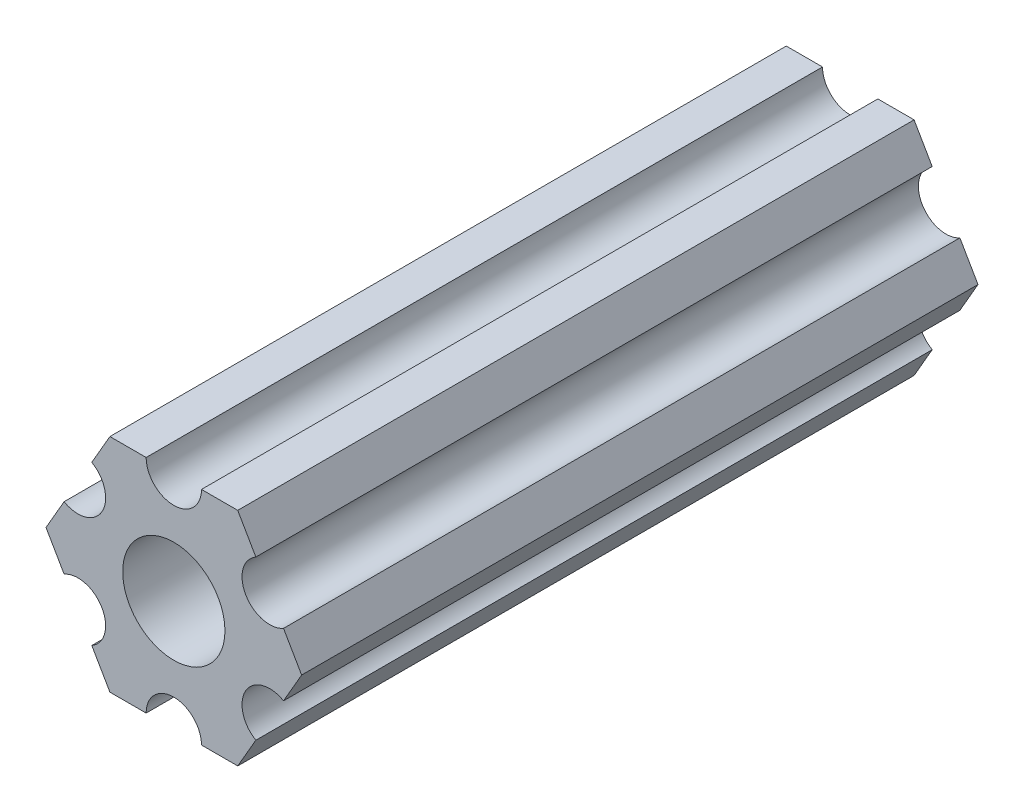
ISO-10303-21;
HEADER;
FILE_DESCRIPTION(('STEP AP214'),'2;1');
FILE_NAME('part.step','',(''),(''),'','','');
FILE_SCHEMA(('AUTOMOTIVE_DESIGN { 1 0 10303 214 1 1 1 1 }'));
ENDSEC;
DATA;
#1=APPLICATION_CONTEXT('core data for automotive mechanical design processes');
#2=APPLICATION_PROTOCOL_DEFINITION('international standard','automotive_design',2000,#1);
#3=PRODUCT_CONTEXT('',#1,'mechanical');
#4=PRODUCT('Part','Part','',(#3));
#5=PRODUCT_RELATED_PRODUCT_CATEGORY('part','',(#4));
#6=PRODUCT_DEFINITION_FORMATION('','',#4);
#7=PRODUCT_DEFINITION_CONTEXT('part definition',#1,'design');
#8=PRODUCT_DEFINITION('design','',#6,#7);
#9=PRODUCT_DEFINITION_SHAPE('','',#8);
#10=(LENGTH_UNIT() NAMED_UNIT(*) SI_UNIT(.MILLI.,.METRE.));
#11=(NAMED_UNIT(*) PLANE_ANGLE_UNIT() SI_UNIT($,.RADIAN.));
#12=(NAMED_UNIT(*) SI_UNIT($,.STERADIAN.) SOLID_ANGLE_UNIT());
#13=UNCERTAINTY_MEASURE_WITH_UNIT(LENGTH_MEASURE(1.E-05),#10,'distance_accuracy_value','');
#14=(GEOMETRIC_REPRESENTATION_CONTEXT(3) GLOBAL_UNCERTAINTY_ASSIGNED_CONTEXT((#13)) GLOBAL_UNIT_ASSIGNED_CONTEXT((#10,
#11,#12)) REPRESENTATION_CONTEXT('',''));
#15=CARTESIAN_POINT('',(0.,0.,0.));
#16=DIRECTION('',(0.,0.,1.));
#17=DIRECTION('',(1.,0.,0.));
#18=AXIS2_PLACEMENT_3D('',#15,#16,#17);
#19=CARTESIAN_POINT('',(621.242126310948,353.435610690712,-38.8));
#20=DIRECTION('',(0.,0.,1.));
#21=DIRECTION('',(1.,0.,0.));
#22=AXIS2_PLACEMENT_3D('',#19,#20,#21);
#23=CYLINDRICAL_SURFACE('',#22,1.58750000000002);
#24=CARTESIAN_POINT('',(621.242126310948,353.435610690712,0.));
#25=DIRECTION('',(0.,0.,-1.));
#26=DIRECTION('',(1.,0.,0.));
#27=AXIS2_PLACEMENT_3D('',#24,#25,#26);
#28=CIRCLE('',#27,1.58750000000002);
#29=CARTESIAN_POINT('',(622.035876310948,352.060795362204,0.));
#30=VERTEX_POINT('',#29);
#31=CARTESIAN_POINT('',(620.448376310948,354.81042601922,0.));
#32=VERTEX_POINT('',#31);
#33=EDGE_CURVE('E273',#30,#32,#28,.T.);
#34=ORIENTED_EDGE('',*,*,#33,.F.);
#35=DIRECTION('',(0.,0.,1.));
#36=VECTOR('',#35,1.);
#37=CARTESIAN_POINT('',(622.035876310948,352.060795362204,-38.8));
#38=LINE('',#37,#36);
#39=CARTESIAN_POINT('',(622.035876310948,352.060795362204,-38.8));
#40=VERTEX_POINT('',#39);
#41=EDGE_CURVE('E11',#40,#30,#38,.T.);
#42=ORIENTED_EDGE('',*,*,#41,.F.);
#43=CARTESIAN_POINT('',(621.242126310948,353.435610690712,-38.8));
#44=DIRECTION('',(0.,0.,-1.));
#45=DIRECTION('',(1.,0.,0.));
#46=AXIS2_PLACEMENT_3D('',#43,#44,#45);
#47=CIRCLE('',#46,1.58749999999999);
#48=CARTESIAN_POINT('',(620.448376310948,354.81042601922,-38.8));
#49=VERTEX_POINT('',#48);
#50=EDGE_CURVE('E63',#40,#49,#47,.T.);
#51=ORIENTED_EDGE('',*,*,#50,.T.);
#52=DIRECTION('',(0.,0.,1.));
#53=VECTOR('',#52,1.);
#54=CARTESIAN_POINT('',(620.448376310948,354.81042601922,-38.8));
#55=LINE('',#54,#53);
#56=EDGE_CURVE('E47',#49,#32,#55,.T.);
#57=ORIENTED_EDGE('',*,*,#56,.T.);
#58=EDGE_LOOP('',(#34,#42,#51,#57));
#59=FACE_BOUND('',#58,.T.);
#60=ADVANCED_FACE('F43',(#59),#23,.F.);
#61=CARTESIAN_POINT('',(623.075213415625,350.260610690712,-38.8));
#62=DIRECTION('',(0.866025403784456,0.49999999999997,0.));
#63=DIRECTION('',(-0.49999999999997,0.866025403784456,0.));
#64=AXIS2_PLACEMENT_3D('',#61,#62,#63);
#65=PLANE('',#64);
#66=DIRECTION('',(-0.49999999999997,0.866025403784456,0.));
#67=VECTOR('',#66,1.);
#68=CARTESIAN_POINT('',(623.075213415625,350.260610690712,0.));
#69=LINE('',#68,#67);
#70=CARTESIAN_POINT('',(623.075213415625,350.260610690712,0.));
#71=VERTEX_POINT('',#70);
#72=EDGE_CURVE('E270',#71,#30,#69,.T.);
#73=ORIENTED_EDGE('',*,*,#72,.F.);
#74=DIRECTION('',(0.,0.,1.));
#75=VECTOR('',#74,1.);
#76=CARTESIAN_POINT('',(623.075213415625,350.260610690712,-38.8));
#77=LINE('',#76,#75);
#78=CARTESIAN_POINT('',(623.075213415625,350.260610690712,-38.8));
#79=VERTEX_POINT('',#78);
#80=EDGE_CURVE('E54',#79,#71,#77,.T.);
#81=ORIENTED_EDGE('',*,*,#80,.F.);
#82=DIRECTION('',(-0.49999999999997,0.866025403784456,0.));
#83=VECTOR('',#82,1.);
#84=CARTESIAN_POINT('',(623.075213415625,350.260610690712,-38.8));
#85=LINE('',#84,#83);
#86=EDGE_CURVE('E194',#79,#40,#85,.T.);
#87=ORIENTED_EDGE('',*,*,#86,.T.);
#88=ORIENTED_EDGE('',*,*,#41,.T.);
#89=EDGE_LOOP('',(#73,#81,#87,#88));
#90=FACE_BOUND('',#89,.T.);
#91=ADVANCED_FACE('F324',(#90),#65,.T.);
#92=CARTESIAN_POINT('',(622.035876310948,348.46042601922,-38.8));
#93=DIRECTION('',(0.86602540378444,-0.499999999999998,0.));
#94=DIRECTION('',(0.499999999999998,0.86602540378444,0.));
#95=AXIS2_PLACEMENT_3D('',#92,#93,#94);
#96=PLANE('',#95);
#97=DIRECTION('',(0.499999999999998,0.86602540378444,0.));
#98=VECTOR('',#97,1.);
#99=CARTESIAN_POINT('',(622.035876310948,348.46042601922,0.));
#100=LINE('',#99,#98);
#101=CARTESIAN_POINT('',(622.035876310948,348.46042601922,0.));
#102=VERTEX_POINT('',#101);
#103=EDGE_CURVE('E181',#102,#71,#100,.T.);
#104=ORIENTED_EDGE('',*,*,#103,.F.);
#105=DIRECTION('',(0.,0.,1.));
#106=VECTOR('',#105,1.);
#107=CARTESIAN_POINT('',(622.035876310948,348.46042601922,-38.8));
#108=LINE('',#107,#106);
#109=CARTESIAN_POINT('',(622.035876310948,348.46042601922,-38.8));
#110=VERTEX_POINT('',#109);
#111=EDGE_CURVE('E176',#110,#102,#108,.T.);
#112=ORIENTED_EDGE('',*,*,#111,.F.);
#113=DIRECTION('',(0.499999999999998,0.86602540378444,0.));
#114=VECTOR('',#113,1.);
#115=CARTESIAN_POINT('',(622.035876310948,348.46042601922,-38.8));
#116=LINE('',#115,#114);
#117=EDGE_CURVE('E179',#110,#79,#116,.T.);
#118=ORIENTED_EDGE('',*,*,#117,.T.);
#119=ORIENTED_EDGE('',*,*,#80,.T.);
#120=EDGE_LOOP('',(#104,#112,#118,#119));
#121=FACE_BOUND('',#120,.T.);
#122=ADVANCED_FACE('F178',(#121),#96,.T.);
#123=CARTESIAN_POINT('',(621.242126310948,347.085610690712,-38.8));
#124=DIRECTION('',(0.,0.,1.));
#125=DIRECTION('',(1.,0.,0.));
#126=AXIS2_PLACEMENT_3D('',#123,#124,#125);
#127=CYLINDRICAL_SURFACE('',#126,1.5875);
#128=CARTESIAN_POINT('',(621.242126310948,347.085610690712,0.));
#129=DIRECTION('',(0.,0.,-1.));
#130=DIRECTION('',(1.,0.,0.));
#131=AXIS2_PLACEMENT_3D('',#128,#129,#130);
#132=CIRCLE('',#131,1.5875);
#133=CARTESIAN_POINT('',(620.448376310948,345.710795362204,0.));
#134=VERTEX_POINT('',#133);
#135=EDGE_CURVE('E265',#134,#102,#132,.T.);
#136=ORIENTED_EDGE('',*,*,#135,.F.);
#137=DIRECTION('',(0.,0.,1.));
#138=VECTOR('',#137,1.);
#139=CARTESIAN_POINT('',(620.448376310948,345.710795362204,-38.8));
#140=LINE('',#139,#138);
#141=CARTESIAN_POINT('',(620.448376310948,345.710795362204,-38.8));
#142=VERTEX_POINT('',#141);
#143=EDGE_CURVE('E187',#142,#134,#140,.T.);
#144=ORIENTED_EDGE('',*,*,#143,.F.);
#145=CARTESIAN_POINT('',(621.242126310948,347.085610690712,-38.8));
#146=DIRECTION('',(0.,0.,-1.));
#147=DIRECTION('',(1.,0.,0.));
#148=AXIS2_PLACEMENT_3D('',#145,#146,#147);
#149=CIRCLE('',#148,1.5875);
#150=EDGE_CURVE('E192',#142,#110,#149,.T.);
#151=ORIENTED_EDGE('',*,*,#150,.T.);
#152=ORIENTED_EDGE('',*,*,#111,.T.);
#153=EDGE_LOOP('',(#136,#144,#151,#152));
#154=FACE_BOUND('',#153,.T.);
#155=ADVANCED_FACE('F197',(#154),#127,.F.);
#156=CARTESIAN_POINT('',(619.409039206271,343.910610690712,-38.8));
#157=DIRECTION('',(0.866025403784433,-0.50000000000001,0.));
#158=DIRECTION('',(0.50000000000001,0.866025403784433,0.));
#159=AXIS2_PLACEMENT_3D('',#156,#157,#158);
#160=PLANE('',#159);
#161=DIRECTION('',(0.50000000000001,0.866025403784433,0.));
#162=VECTOR('',#161,1.);
#163=CARTESIAN_POINT('',(619.409039206271,343.910610690712,0.));
#164=LINE('',#163,#162);
#165=CARTESIAN_POINT('',(619.409039206271,343.910610690712,0.));
#166=VERTEX_POINT('',#165);
#167=EDGE_CURVE('E261',#166,#134,#164,.T.);
#168=ORIENTED_EDGE('',*,*,#167,.F.);
#169=DIRECTION('',(0.,0.,1.));
#170=VECTOR('',#169,1.);
#171=CARTESIAN_POINT('',(619.409039206271,343.910610690712,-38.8));
#172=LINE('',#171,#170);
#173=CARTESIAN_POINT('',(619.409039206271,343.910610690712,-38.8));
#174=VERTEX_POINT('',#173);
#175=EDGE_CURVE('E280',#174,#166,#172,.T.);
#176=ORIENTED_EDGE('',*,*,#175,.F.);
#177=DIRECTION('',(0.50000000000001,0.866025403784433,0.));
#178=VECTOR('',#177,1.);
#179=CARTESIAN_POINT('',(619.409039206271,343.910610690712,-38.8));
#180=LINE('',#179,#178);
#181=EDGE_CURVE('E199',#174,#142,#180,.T.);
#182=ORIENTED_EDGE('',*,*,#181,.T.);
#183=ORIENTED_EDGE('',*,*,#143,.T.);
#184=EDGE_LOOP('',(#168,#176,#182,#183));
#185=FACE_BOUND('',#184,.T.);
#186=ADVANCED_FACE('F337',(#185),#160,.T.);
#187=CARTESIAN_POINT('',(617.330364996917,343.910610690712,-38.8));
#188=DIRECTION('',(0.,-1.,0.));
#189=DIRECTION('',(1.,0.,0.));
#190=AXIS2_PLACEMENT_3D('',#187,#188,#189);
#191=PLANE('',#190);
#192=DIRECTION('',(1.,0.,0.));
#193=VECTOR('',#192,1.);
#194=CARTESIAN_POINT('',(617.330364996917,343.910610690712,0.));
#195=LINE('',#194,#193);
#196=CARTESIAN_POINT('',(617.330364996917,343.910610690712,0.));
#197=VERTEX_POINT('',#196);
#198=EDGE_CURVE('E257',#197,#166,#195,.T.);
#199=ORIENTED_EDGE('',*,*,#198,.F.);
#200=DIRECTION('',(0.,0.,1.));
#201=VECTOR('',#200,1.);
#202=CARTESIAN_POINT('',(617.330364996917,343.910610690712,-38.8));
#203=LINE('',#202,#201);
#204=CARTESIAN_POINT('',(617.330364996917,343.910610690712,-38.8));
#205=VERTEX_POINT('',#204);
#206=EDGE_CURVE('E283',#205,#197,#203,.T.);
#207=ORIENTED_EDGE('',*,*,#206,.F.);
#208=DIRECTION('',(1.,0.,0.));
#209=VECTOR('',#208,1.);
#210=CARTESIAN_POINT('',(617.330364996917,343.910610690712,-38.8));
#211=LINE('',#210,#209);
#212=EDGE_CURVE('E202',#205,#174,#211,.T.);
#213=ORIENTED_EDGE('',*,*,#212,.T.);
#214=ORIENTED_EDGE('',*,*,#175,.T.);
#215=EDGE_LOOP('',(#199,#207,#213,#214));
#216=FACE_BOUND('',#215,.T.);
#217=ADVANCED_FACE('F340',(#216),#191,.T.);
#218=CARTESIAN_POINT('',(615.742864996917,343.910610690712,-38.8));
#219=DIRECTION('',(0.,0.,1.));
#220=DIRECTION('',(1.,0.,0.));
#221=AXIS2_PLACEMENT_3D('',#218,#219,#220);
#222=CYLINDRICAL_SURFACE('',#221,1.58750000000002);
#223=CARTESIAN_POINT('',(615.742864996917,343.910610690712,0.));
#224=DIRECTION('',(0.,0.,-1.));
#225=DIRECTION('',(1.,0.,0.));
#226=AXIS2_PLACEMENT_3D('',#223,#224,#225);
#227=CIRCLE('',#226,1.58750000000002);
#228=CARTESIAN_POINT('',(614.155364996917,343.910610690712,0.));
#229=VERTEX_POINT('',#228);
#230=EDGE_CURVE('E253',#229,#197,#227,.T.);
#231=ORIENTED_EDGE('',*,*,#230,.F.);
#232=DIRECTION('',(0.,0.,1.));
#233=VECTOR('',#232,1.);
#234=CARTESIAN_POINT('',(614.155364996917,343.910610690712,-38.8));
#235=LINE('',#234,#233);
#236=CARTESIAN_POINT('',(614.155364996917,343.910610690712,-38.8));
#237=VERTEX_POINT('',#236);
#238=EDGE_CURVE('E286',#237,#229,#235,.T.);
#239=ORIENTED_EDGE('',*,*,#238,.F.);
#240=CARTESIAN_POINT('',(615.742864996917,343.910610690712,-38.8));
#241=DIRECTION('',(0.,0.,-1.));
#242=DIRECTION('',(1.,0.,0.));
#243=AXIS2_PLACEMENT_3D('',#240,#241,#242);
#244=CIRCLE('',#243,1.58750000000002);
#245=EDGE_CURVE('E437',#237,#205,#244,.T.);
#246=ORIENTED_EDGE('',*,*,#245,.T.);
#247=ORIENTED_EDGE('',*,*,#206,.T.);
#248=EDGE_LOOP('',(#231,#239,#246,#247));
#249=FACE_BOUND('',#248,.T.);
#250=ADVANCED_FACE('F344',(#249),#222,.F.);
#251=CARTESIAN_POINT('',(612.076690787563,343.910610690712,-38.8));
#252=DIRECTION('',(0.,-1.,0.));
#253=DIRECTION('',(1.,0.,0.));
#254=AXIS2_PLACEMENT_3D('',#251,#252,#253);
#255=PLANE('',#254);
#256=DIRECTION('',(1.,0.,0.));
#257=VECTOR('',#256,1.);
#258=CARTESIAN_POINT('',(612.076690787563,343.910610690712,0.));
#259=LINE('',#258,#257);
#260=CARTESIAN_POINT('',(612.076690787563,343.910610690712,0.));
#261=VERTEX_POINT('',#260);
#262=EDGE_CURVE('E249',#261,#229,#259,.T.);
#263=ORIENTED_EDGE('',*,*,#262,.F.);
#264=DIRECTION('',(0.,0.,1.));
#265=VECTOR('',#264,1.);
#266=CARTESIAN_POINT('',(612.076690787563,343.910610690712,-38.8));
#267=LINE('',#266,#265);
#268=CARTESIAN_POINT('',(612.076690787563,343.910610690712,-38.8));
#269=VERTEX_POINT('',#268);
#270=EDGE_CURVE('E289',#269,#261,#267,.T.);
#271=ORIENTED_EDGE('',*,*,#270,.F.);
#272=DIRECTION('',(1.,0.,0.));
#273=VECTOR('',#272,1.);
#274=CARTESIAN_POINT('',(612.076690787563,343.910610690712,-38.8));
#275=LINE('',#274,#273);
#276=EDGE_CURVE('E433',#269,#237,#275,.T.);
#277=ORIENTED_EDGE('',*,*,#276,.T.);
#278=ORIENTED_EDGE('',*,*,#238,.T.);
#279=EDGE_LOOP('',(#263,#271,#277,#278));
#280=FACE_BOUND('',#279,.T.);
#281=ADVANCED_FACE('F348',(#280),#255,.T.);
#282=CARTESIAN_POINT('',(611.037353682886,345.710795362204,-38.8));
#283=DIRECTION('',(-0.866025403784446,-0.499999999999987,0.));
#284=DIRECTION('',(0.499999999999987,-0.866025403784446,0.));
#285=AXIS2_PLACEMENT_3D('',#282,#283,#284);
#286=PLANE('',#285);
#287=DIRECTION('',(0.499999999999987,-0.866025403784446,0.));
#288=VECTOR('',#287,1.);
#289=CARTESIAN_POINT('',(611.037353682886,345.710795362204,0.));
#290=LINE('',#289,#288);
#291=CARTESIAN_POINT('',(611.037353682886,345.710795362204,0.));
#292=VERTEX_POINT('',#291);
#293=EDGE_CURVE('E245',#292,#261,#290,.T.);
#294=ORIENTED_EDGE('',*,*,#293,.F.);
#295=DIRECTION('',(0.,0.,1.));
#296=VECTOR('',#295,1.);
#297=CARTESIAN_POINT('',(611.037353682886,345.710795362204,-38.8));
#298=LINE('',#297,#296);
#299=CARTESIAN_POINT('',(611.037353682886,345.710795362204,-38.8));
#300=VERTEX_POINT('',#299);
#301=EDGE_CURVE('E292',#300,#292,#298,.T.);
#302=ORIENTED_EDGE('',*,*,#301,.F.);
#303=DIRECTION('',(0.499999999999987,-0.866025403784446,0.));
#304=VECTOR('',#303,1.);
#305=CARTESIAN_POINT('',(611.037353682886,345.710795362204,-38.8));
#306=LINE('',#305,#304);
#307=EDGE_CURVE('E429',#300,#269,#306,.T.);
#308=ORIENTED_EDGE('',*,*,#307,.T.);
#309=ORIENTED_EDGE('',*,*,#270,.T.);
#310=EDGE_LOOP('',(#294,#302,#308,#309));
#311=FACE_BOUND('',#310,.T.);
#312=ADVANCED_FACE('F352',(#311),#286,.T.);
#313=CARTESIAN_POINT('',(610.243603682886,347.085610690712,-38.8));
#314=DIRECTION('',(0.,0.,1.));
#315=DIRECTION('',(1.,0.,0.));
#316=AXIS2_PLACEMENT_3D('',#313,#314,#315);
#317=CYLINDRICAL_SURFACE('',#316,1.5875);
#318=CARTESIAN_POINT('',(610.243603682886,347.085610690712,0.));
#319=DIRECTION('',(0.,0.,-1.));
#320=DIRECTION('',(1.,0.,0.));
#321=AXIS2_PLACEMENT_3D('',#318,#319,#320);
#322=CIRCLE('',#321,1.5875);
#323=CARTESIAN_POINT('',(609.449853682886,348.46042601922,0.));
#324=VERTEX_POINT('',#323);
#325=EDGE_CURVE('E241',#324,#292,#322,.T.);
#326=ORIENTED_EDGE('',*,*,#325,.F.);
#327=DIRECTION('',(0.,0.,1.));
#328=VECTOR('',#327,1.);
#329=CARTESIAN_POINT('',(609.449853682886,348.46042601922,-38.8));
#330=LINE('',#329,#328);
#331=CARTESIAN_POINT('',(609.449853682886,348.46042601922,-38.8));
#332=VERTEX_POINT('',#331);
#333=EDGE_CURVE('E295',#332,#324,#330,.T.);
#334=ORIENTED_EDGE('',*,*,#333,.F.);
#335=CARTESIAN_POINT('',(610.243603682886,347.085610690712,-38.8));
#336=DIRECTION('',(0.,0.,-1.));
#337=DIRECTION('',(1.,0.,0.));
#338=AXIS2_PLACEMENT_3D('',#335,#336,#337);
#339=CIRCLE('',#338,1.5875);
#340=EDGE_CURVE('E425',#332,#300,#339,.T.);
#341=ORIENTED_EDGE('',*,*,#340,.T.);
#342=ORIENTED_EDGE('',*,*,#301,.T.);
#343=EDGE_LOOP('',(#326,#334,#341,#342));
#344=FACE_BOUND('',#343,.T.);
#345=ADVANCED_FACE('F356',(#344),#317,.F.);
#346=CARTESIAN_POINT('',(608.410516578209,350.260610690712,-38.8));
#347=DIRECTION('',(-0.866025403784449,-0.499999999999981,0.));
#348=DIRECTION('',(0.499999999999981,-0.866025403784449,0.));
#349=AXIS2_PLACEMENT_3D('',#346,#347,#348);
#350=PLANE('',#349);
#351=DIRECTION('',(0.499999999999981,-0.866025403784449,0.));
#352=VECTOR('',#351,1.);
#353=CARTESIAN_POINT('',(608.410516578209,350.260610690712,0.));
#354=LINE('',#353,#352);
#355=CARTESIAN_POINT('',(608.410516578209,350.260610690712,0.));
#356=VERTEX_POINT('',#355);
#357=EDGE_CURVE('E237',#356,#324,#354,.T.);
#358=ORIENTED_EDGE('',*,*,#357,.F.);
#359=DIRECTION('',(0.,0.,1.));
#360=VECTOR('',#359,1.);
#361=CARTESIAN_POINT('',(608.410516578209,350.260610690712,-38.8));
#362=LINE('',#361,#360);
#363=CARTESIAN_POINT('',(608.410516578209,350.260610690712,-38.8));
#364=VERTEX_POINT('',#363);
#365=EDGE_CURVE('E298',#364,#356,#362,.T.);
#366=ORIENTED_EDGE('',*,*,#365,.F.);
#367=DIRECTION('',(0.499999999999981,-0.866025403784449,0.));
#368=VECTOR('',#367,1.);
#369=CARTESIAN_POINT('',(608.410516578209,350.260610690712,-38.8));
#370=LINE('',#369,#368);
#371=EDGE_CURVE('E421',#364,#332,#370,.T.);
#372=ORIENTED_EDGE('',*,*,#371,.T.);
#373=ORIENTED_EDGE('',*,*,#333,.T.);
#374=EDGE_LOOP('',(#358,#366,#372,#373));
#375=FACE_BOUND('',#374,.T.);
#376=ADVANCED_FACE('F360',(#375),#350,.T.);
#377=CARTESIAN_POINT('',(609.449853682886,352.060795362204,-38.8));
#378=DIRECTION('',(-0.866025403784446,0.499999999999987,0.));
#379=DIRECTION('',(-0.499999999999987,-0.866025403784446,0.));
#380=AXIS2_PLACEMENT_3D('',#377,#378,#379);
#381=PLANE('',#380);
#382=DIRECTION('',(-0.499999999999987,-0.866025403784446,0.));
#383=VECTOR('',#382,1.);
#384=CARTESIAN_POINT('',(609.449853682886,352.060795362204,0.));
#385=LINE('',#384,#383);
#386=CARTESIAN_POINT('',(609.449853682886,352.060795362204,0.));
#387=VERTEX_POINT('',#386);
#388=EDGE_CURVE('E233',#387,#356,#385,.T.);
#389=ORIENTED_EDGE('',*,*,#388,.F.);
#390=DIRECTION('',(0.,0.,1.));
#391=VECTOR('',#390,1.);
#392=CARTESIAN_POINT('',(609.449853682886,352.060795362204,-38.8));
#393=LINE('',#392,#391);
#394=CARTESIAN_POINT('',(609.449853682886,352.060795362204,-38.8));
#395=VERTEX_POINT('',#394);
#396=EDGE_CURVE('E301',#395,#387,#393,.T.);
#397=ORIENTED_EDGE('',*,*,#396,.F.);
#398=DIRECTION('',(-0.499999999999987,-0.866025403784446,0.));
#399=VECTOR('',#398,1.);
#400=CARTESIAN_POINT('',(609.449853682886,352.060795362204,-38.8));
#401=LINE('',#400,#399);
#402=EDGE_CURVE('E417',#395,#364,#401,.T.);
#403=ORIENTED_EDGE('',*,*,#402,.T.);
#404=ORIENTED_EDGE('',*,*,#365,.T.);
#405=EDGE_LOOP('',(#389,#397,#403,#404));
#406=FACE_BOUND('',#405,.T.);
#407=ADVANCED_FACE('F364',(#406),#381,.T.);
#408=CARTESIAN_POINT('',(610.243603682886,353.435610690712,-38.8));
#409=DIRECTION('',(0.,0.,1.));
#410=DIRECTION('',(1.,0.,0.));
#411=AXIS2_PLACEMENT_3D('',#408,#409,#410);
#412=CYLINDRICAL_SURFACE('',#411,1.5875);
#413=CARTESIAN_POINT('',(610.243603682886,353.435610690712,0.));
#414=DIRECTION('',(0.,0.,-1.));
#415=DIRECTION('',(1.,0.,0.));
#416=AXIS2_PLACEMENT_3D('',#413,#414,#415);
#417=CIRCLE('',#416,1.5875);
#418=CARTESIAN_POINT('',(611.037353682886,354.81042601922,0.));
#419=VERTEX_POINT('',#418);
#420=EDGE_CURVE('E229',#419,#387,#417,.T.);
#421=ORIENTED_EDGE('',*,*,#420,.F.);
#422=DIRECTION('',(0.,0.,1.));
#423=VECTOR('',#422,1.);
#424=CARTESIAN_POINT('',(611.037353682886,354.81042601922,-38.8));
#425=LINE('',#424,#423);
#426=CARTESIAN_POINT('',(611.037353682886,354.81042601922,-38.8));
#427=VERTEX_POINT('',#426);
#428=EDGE_CURVE('E304',#427,#419,#425,.T.);
#429=ORIENTED_EDGE('',*,*,#428,.F.);
#430=CARTESIAN_POINT('',(610.243603682886,353.435610690712,-38.8));
#431=DIRECTION('',(0.,0.,-1.));
#432=DIRECTION('',(1.,0.,0.));
#433=AXIS2_PLACEMENT_3D('',#430,#431,#432);
#434=CIRCLE('',#433,1.5875);
#435=EDGE_CURVE('E413',#427,#395,#434,.T.);
#436=ORIENTED_EDGE('',*,*,#435,.T.);
#437=ORIENTED_EDGE('',*,*,#396,.T.);
#438=EDGE_LOOP('',(#421,#429,#436,#437));
#439=FACE_BOUND('',#438,.T.);
#440=ADVANCED_FACE('F368',(#439),#412,.F.);
#441=CARTESIAN_POINT('',(612.076690787563,356.610610690712,-38.8));
#442=DIRECTION('',(-0.866025403784433,0.50000000000001,0.));
#443=DIRECTION('',(-0.50000000000001,-0.866025403784433,0.));
#444=AXIS2_PLACEMENT_3D('',#441,#442,#443);
#445=PLANE('',#444);
#446=DIRECTION('',(-0.50000000000001,-0.866025403784433,0.));
#447=VECTOR('',#446,1.);
#448=CARTESIAN_POINT('',(612.076690787563,356.610610690712,0.));
#449=LINE('',#448,#447);
#450=CARTESIAN_POINT('',(612.076690787563,356.610610690712,0.));
#451=VERTEX_POINT('',#450);
#452=EDGE_CURVE('E225',#451,#419,#449,.T.);
#453=ORIENTED_EDGE('',*,*,#452,.F.);
#454=DIRECTION('',(0.,0.,1.));
#455=VECTOR('',#454,1.);
#456=CARTESIAN_POINT('',(612.076690787563,356.610610690712,-38.8));
#457=LINE('',#456,#455);
#458=CARTESIAN_POINT('',(612.076690787563,356.610610690712,-38.8));
#459=VERTEX_POINT('',#458);
#460=EDGE_CURVE('E307',#459,#451,#457,.T.);
#461=ORIENTED_EDGE('',*,*,#460,.F.);
#462=DIRECTION('',(-0.50000000000001,-0.866025403784433,0.));
#463=VECTOR('',#462,1.);
#464=CARTESIAN_POINT('',(612.076690787563,356.610610690712,-38.8));
#465=LINE('',#464,#463);
#466=EDGE_CURVE('E404',#459,#427,#465,.T.);
#467=ORIENTED_EDGE('',*,*,#466,.T.);
#468=ORIENTED_EDGE('',*,*,#428,.T.);
#469=EDGE_LOOP('',(#453,#461,#467,#468));
#470=FACE_BOUND('',#469,.T.);
#471=ADVANCED_FACE('F372',(#470),#445,.T.);
#472=CARTESIAN_POINT('',(614.155364996917,356.610610690712,-38.8));
#473=DIRECTION('',(0.,1.,0.));
#474=DIRECTION('',(-1.,0.,0.));
#475=AXIS2_PLACEMENT_3D('',#472,#473,#474);
#476=PLANE('',#475);
#477=DIRECTION('',(-1.,0.,0.));
#478=VECTOR('',#477,1.);
#479=CARTESIAN_POINT('',(614.155364996917,356.610610690712,0.));
#480=LINE('',#479,#478);
#481=CARTESIAN_POINT('',(614.155364996917,356.610610690712,0.));
#482=VERTEX_POINT('',#481);
#483=EDGE_CURVE('E221',#482,#451,#480,.T.);
#484=ORIENTED_EDGE('',*,*,#483,.F.);
#485=DIRECTION('',(0.,0.,1.));
#486=VECTOR('',#485,1.);
#487=CARTESIAN_POINT('',(614.155364996917,356.610610690712,-38.8));
#488=LINE('',#487,#486);
#489=CARTESIAN_POINT('',(614.155364996917,356.610610690712,-38.8));
#490=VERTEX_POINT('',#489);
#491=EDGE_CURVE('E310',#490,#482,#488,.T.);
#492=ORIENTED_EDGE('',*,*,#491,.F.);
#493=DIRECTION('',(-1.,0.,0.));
#494=VECTOR('',#493,1.);
#495=CARTESIAN_POINT('',(614.155364996917,356.610610690712,-38.8));
#496=LINE('',#495,#494);
#497=EDGE_CURVE('E399',#490,#459,#496,.T.);
#498=ORIENTED_EDGE('',*,*,#497,.T.);
#499=ORIENTED_EDGE('',*,*,#460,.T.);
#500=EDGE_LOOP('',(#484,#492,#498,#499));
#501=FACE_BOUND('',#500,.T.);
#502=ADVANCED_FACE('F376',(#501),#476,.T.);
#503=CARTESIAN_POINT('',(615.742864996917,356.610610690712,-38.8));
#504=DIRECTION('',(0.,0.,1.));
#505=DIRECTION('',(1.,0.,0.));
#506=AXIS2_PLACEMENT_3D('',#503,#504,#505);
#507=CYLINDRICAL_SURFACE('',#506,1.58750000000001);
#508=CARTESIAN_POINT('',(615.742864996917,356.610610690712,0.));
#509=DIRECTION('',(0.,0.,-1.));
#510=DIRECTION('',(1.,0.,0.));
#511=AXIS2_PLACEMENT_3D('',#508,#509,#510);
#512=CIRCLE('',#511,1.58750000000001);
#513=CARTESIAN_POINT('',(617.330364996917,356.610610690712,0.));
#514=VERTEX_POINT('',#513);
#515=EDGE_CURVE('E217',#514,#482,#512,.T.);
#516=ORIENTED_EDGE('',*,*,#515,.F.);
#517=DIRECTION('',(0.,0.,1.));
#518=VECTOR('',#517,1.);
#519=CARTESIAN_POINT('',(617.330364996917,356.610610690712,-38.8));
#520=LINE('',#519,#518);
#521=CARTESIAN_POINT('',(617.330364996917,356.610610690712,-38.8));
#522=VERTEX_POINT('',#521);
#523=EDGE_CURVE('E313',#522,#514,#520,.T.);
#524=ORIENTED_EDGE('',*,*,#523,.F.);
#525=CARTESIAN_POINT('',(615.742864996917,356.610610690712,-38.8));
#526=DIRECTION('',(0.,0.,-1.));
#527=DIRECTION('',(1.,0.,0.));
#528=AXIS2_PLACEMENT_3D('',#525,#526,#527);
#529=CIRCLE('',#528,1.58750000000007);
#530=EDGE_CURVE('E394',#522,#490,#529,.T.);
#531=ORIENTED_EDGE('',*,*,#530,.T.);
#532=ORIENTED_EDGE('',*,*,#491,.T.);
#533=EDGE_LOOP('',(#516,#524,#531,#532));
#534=FACE_BOUND('',#533,.T.);
#535=ADVANCED_FACE('F380',(#534),#507,.F.);
#536=CARTESIAN_POINT('',(619.409039206271,356.610610690712,-38.8));
#537=DIRECTION('',(0.,1.,0.));
#538=DIRECTION('',(0.,0.,1.));
#539=AXIS2_PLACEMENT_3D('',#536,#537,#538);
#540=PLANE('',#539);
#541=DIRECTION('',(-1.,0.,0.));
#542=VECTOR('',#541,1.);
#543=CARTESIAN_POINT('',(619.409039206271,356.610610690712,0.));
#544=LINE('',#543,#542);
#545=CARTESIAN_POINT('',(619.409039206271,356.610610690712,0.));
#546=VERTEX_POINT('',#545);
#547=EDGE_CURVE('E212',#546,#514,#544,.T.);
#548=ORIENTED_EDGE('',*,*,#547,.F.);
#549=DIRECTION('',(0.,0.,1.));
#550=VECTOR('',#549,1.);
#551=CARTESIAN_POINT('',(619.409039206271,356.610610690712,-38.8));
#552=LINE('',#551,#550);
#553=CARTESIAN_POINT('',(619.409039206271,356.610610690712,-38.8));
#554=VERTEX_POINT('',#553);
#555=EDGE_CURVE('E316',#554,#546,#552,.T.);
#556=ORIENTED_EDGE('',*,*,#555,.F.);
#557=DIRECTION('',(-1.,0.,0.));
#558=VECTOR('',#557,1.);
#559=CARTESIAN_POINT('',(619.409039206271,356.610610690712,-38.8));
#560=LINE('',#559,#558);
#561=EDGE_CURVE('E392',#554,#522,#560,.T.);
#562=ORIENTED_EDGE('',*,*,#561,.T.);
#563=ORIENTED_EDGE('',*,*,#523,.T.);
#564=EDGE_LOOP('',(#548,#556,#562,#563));
#565=FACE_BOUND('',#564,.T.);
#566=ADVANCED_FACE('F383',(#565),#540,.T.);
#567=CARTESIAN_POINT('',(620.448376310948,354.81042601922,-38.8));
#568=DIRECTION('',(0.866025403784446,0.499999999999987,0.));
#569=DIRECTION('',(-0.499999999999987,0.866025403784446,0.));
#570=AXIS2_PLACEMENT_3D('',#567,#568,#569);
#571=PLANE('',#570);
#572=DIRECTION('',(-0.499999999999987,0.866025403784446,0.));
#573=VECTOR('',#572,1.);
#574=CARTESIAN_POINT('',(620.448376310948,354.81042601922,0.));
#575=LINE('',#574,#573);
#576=EDGE_CURVE('E208',#32,#546,#575,.T.);
#577=ORIENTED_EDGE('',*,*,#576,.F.);
#578=ORIENTED_EDGE('',*,*,#56,.F.);
#579=DIRECTION('',(-0.499999999999987,0.866025403784446,0.));
#580=VECTOR('',#579,1.);
#581=CARTESIAN_POINT('',(620.448376310948,354.81042601922,-38.8));
#582=LINE('',#581,#580);
#583=EDGE_CURVE('E406',#49,#554,#582,.T.);
#584=ORIENTED_EDGE('',*,*,#583,.T.);
#585=ORIENTED_EDGE('',*,*,#555,.T.);
#586=EDGE_LOOP('',(#577,#578,#584,#585));
#587=FACE_BOUND('',#586,.T.);
#588=ADVANCED_FACE('F45',(#587),#571,.T.);
#589=CARTESIAN_POINT('',(621.242126310948,353.435610690712,-38.8));
#590=DIRECTION('',(0.,0.,1.));
#591=DIRECTION('',(1.,0.,0.));
#592=AXIS2_PLACEMENT_3D('',#589,#590,#591);
#593=PLANE('',#592);
#594=CARTESIAN_POINT('',(615.742864996917,350.260610690712,-38.8));
#595=DIRECTION('',(0.,0.,1.));
#596=DIRECTION('',(1.,0.,0.));
#597=AXIS2_PLACEMENT_3D('',#594,#595,#596);
#598=CIRCLE('',#597,2.9337);
#599=CARTESIAN_POINT('',(618.676564996917,350.260610690712,-38.8));
#600=VERTEX_POINT('',#599);
#601=EDGE_CURVE('E213',#600,#600,#598,.T.);
#602=ORIENTED_EDGE('',*,*,#601,.T.);
#603=EDGE_LOOP('',(#602));
#604=FACE_BOUND('',#603,.T.);
#605=ORIENTED_EDGE('',*,*,#50,.F.);
#606=ORIENTED_EDGE('',*,*,#86,.F.);
#607=ORIENTED_EDGE('',*,*,#117,.F.);
#608=ORIENTED_EDGE('',*,*,#150,.F.);
#609=ORIENTED_EDGE('',*,*,#181,.F.);
#610=ORIENTED_EDGE('',*,*,#212,.F.);
#611=ORIENTED_EDGE('',*,*,#245,.F.);
#612=ORIENTED_EDGE('',*,*,#276,.F.);
#613=ORIENTED_EDGE('',*,*,#307,.F.);
#614=ORIENTED_EDGE('',*,*,#340,.F.);
#615=ORIENTED_EDGE('',*,*,#371,.F.);
#616=ORIENTED_EDGE('',*,*,#402,.F.);
#617=ORIENTED_EDGE('',*,*,#435,.F.);
#618=ORIENTED_EDGE('',*,*,#466,.F.);
#619=ORIENTED_EDGE('',*,*,#497,.F.);
#620=ORIENTED_EDGE('',*,*,#530,.F.);
#621=ORIENTED_EDGE('',*,*,#561,.F.);
#622=ORIENTED_EDGE('',*,*,#583,.F.);
#623=EDGE_LOOP('',(#605,#606,#607,#608,#609,#610,#611,#612,#613,#614,#615,#616,#617,#618,#619,
#620,#621,#622));
#624=FACE_BOUND('',#623,.T.);
#625=ADVANCED_FACE('F190',(#604,#624),#593,.F.);
#626=CARTESIAN_POINT('',(621.242126310948,353.435610690712,0.));
#627=DIRECTION('',(0.,0.,1.));
#628=DIRECTION('',(1.,0.,0.));
#629=AXIS2_PLACEMENT_3D('',#626,#627,#628);
#630=PLANE('',#629);
#631=CARTESIAN_POINT('',(615.742864996917,350.260610690712,0.));
#632=DIRECTION('',(0.,0.,1.));
#633=DIRECTION('',(1.,0.,0.));
#634=AXIS2_PLACEMENT_3D('',#631,#632,#633);
#635=CIRCLE('',#634,2.9337);
#636=CARTESIAN_POINT('',(618.676564996917,350.260610690712,0.));
#637=VERTEX_POINT('',#636);
#638=EDGE_CURVE('E465',#637,#637,#635,.T.);
#639=ORIENTED_EDGE('',*,*,#638,.F.);
#640=EDGE_LOOP('',(#639));
#641=FACE_BOUND('',#640,.T.);
#642=ORIENTED_EDGE('',*,*,#33,.T.);
#643=ORIENTED_EDGE('',*,*,#576,.T.);
#644=ORIENTED_EDGE('',*,*,#547,.T.);
#645=ORIENTED_EDGE('',*,*,#515,.T.);
#646=ORIENTED_EDGE('',*,*,#483,.T.);
#647=ORIENTED_EDGE('',*,*,#452,.T.);
#648=ORIENTED_EDGE('',*,*,#420,.T.);
#649=ORIENTED_EDGE('',*,*,#388,.T.);
#650=ORIENTED_EDGE('',*,*,#357,.T.);
#651=ORIENTED_EDGE('',*,*,#325,.T.);
#652=ORIENTED_EDGE('',*,*,#293,.T.);
#653=ORIENTED_EDGE('',*,*,#262,.T.);
#654=ORIENTED_EDGE('',*,*,#230,.T.);
#655=ORIENTED_EDGE('',*,*,#198,.T.);
#656=ORIENTED_EDGE('',*,*,#167,.T.);
#657=ORIENTED_EDGE('',*,*,#135,.T.);
#658=ORIENTED_EDGE('',*,*,#103,.T.);
#659=ORIENTED_EDGE('',*,*,#72,.T.);
#660=EDGE_LOOP('',(#642,#643,#644,#645,#646,#647,#648,#649,#650,#651,#652,#653,#654,#655,#656,
#657,#658,#659));
#661=FACE_BOUND('',#660,.T.);
#662=ADVANCED_FACE('F323',(#641,#661),#630,.T.);
#663=CARTESIAN_POINT('',(615.742864996917,350.260610690712,-38.8));
#664=DIRECTION('',(0.,0.,1.));
#665=DIRECTION('',(1.,0.,0.));
#666=AXIS2_PLACEMENT_3D('',#663,#664,#665);
#667=CYLINDRICAL_SURFACE('',#666,2.9337);
#668=ORIENTED_EDGE('',*,*,#638,.T.);
#669=EDGE_LOOP('',(#668));
#670=FACE_BOUND('',#669,.T.);
#671=ORIENTED_EDGE('',*,*,#601,.F.);
#672=EDGE_LOOP('',(#671));
#673=FACE_BOUND('',#672,.T.);
#674=ADVANCED_FACE('F474',(#670,#673),#667,.F.);
#675=CLOSED_SHELL('',(#60,#91,#122,#155,#186,#217,#250,#281,#312,#345,#376,#407,#440,#471,#502,
#535,#566,#588,#625,#662,#674));
#676=MANIFOLD_SOLID_BREP('B2',#675);
#677=ADVANCED_BREP_SHAPE_REPRESENTATION('',(#18,#676),#14);
#678=SHAPE_DEFINITION_REPRESENTATION(#9,#677);
ENDSEC;
END-ISO-10303-21;
